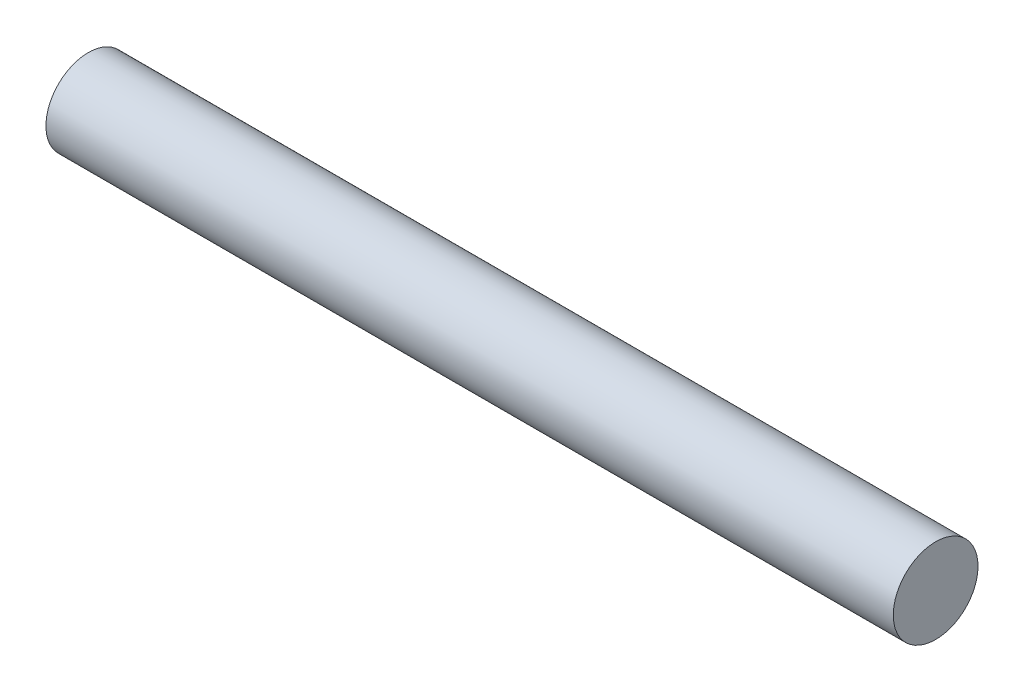
ISO-10303-21;
HEADER;
FILE_DESCRIPTION(('STEP AP214'),'2;1');
FILE_NAME('part.step','',(''),(''),'','','');
FILE_SCHEMA(('AUTOMOTIVE_DESIGN { 1 0 10303 214 1 1 1 1 }'));
ENDSEC;
DATA;
#1=APPLICATION_CONTEXT('core data for automotive mechanical design processes');
#2=APPLICATION_PROTOCOL_DEFINITION('international standard','automotive_design',2000,#1);
#3=PRODUCT_CONTEXT('',#1,'mechanical');
#4=PRODUCT('Part','Part','',(#3));
#5=PRODUCT_RELATED_PRODUCT_CATEGORY('part','',(#4));
#6=PRODUCT_DEFINITION_FORMATION('','',#4);
#7=PRODUCT_DEFINITION_CONTEXT('part definition',#1,'design');
#8=PRODUCT_DEFINITION('design','',#6,#7);
#9=PRODUCT_DEFINITION_SHAPE('','',#8);
#10=(LENGTH_UNIT() NAMED_UNIT(*) SI_UNIT(.MILLI.,.METRE.));
#11=(NAMED_UNIT(*) PLANE_ANGLE_UNIT() SI_UNIT($,.RADIAN.));
#12=(NAMED_UNIT(*) SI_UNIT($,.STERADIAN.) SOLID_ANGLE_UNIT());
#13=UNCERTAINTY_MEASURE_WITH_UNIT(LENGTH_MEASURE(1.E-05),#10,'distance_accuracy_value','');
#14=(GEOMETRIC_REPRESENTATION_CONTEXT(3) GLOBAL_UNCERTAINTY_ASSIGNED_CONTEXT((#13)) GLOBAL_UNIT_ASSIGNED_CONTEXT((#10,
#11,#12)) REPRESENTATION_CONTEXT('',''));
#15=CARTESIAN_POINT('',(0.,0.,0.));
#16=DIRECTION('',(0.,0.,1.));
#17=DIRECTION('',(1.,0.,0.));
#18=AXIS2_PLACEMENT_3D('',#15,#16,#17);
#19=CARTESIAN_POINT('',(30.,0.,0.));
#20=DIRECTION('',(-1.,0.,0.));
#21=DIRECTION('',(0.,0.,1.));
#22=AXIS2_PLACEMENT_3D('',#19,#20,#21);
#23=CYLINDRICAL_SURFACE('',#22,1.5);
#24=CARTESIAN_POINT('',(30.,0.,0.));
#25=DIRECTION('',(1.,0.,0.));
#26=DIRECTION('',(0.,0.,-1.));
#27=AXIS2_PLACEMENT_3D('',#24,#25,#26);
#28=CIRCLE('',#27,1.5);
#29=CARTESIAN_POINT('',(30.,0.,-1.5));
#30=VERTEX_POINT('',#29);
#31=EDGE_CURVE('E10',#30,#30,#28,.T.);
#32=ORIENTED_EDGE('',*,*,#31,.F.);
#33=EDGE_LOOP('',(#32));
#34=FACE_BOUND('',#33,.T.);
#35=CARTESIAN_POINT('',(0.,0.,0.));
#36=DIRECTION('',(1.,0.,0.));
#37=DIRECTION('',(0.,0.,-1.));
#38=AXIS2_PLACEMENT_3D('',#35,#36,#37);
#39=CIRCLE('',#38,1.5);
#40=CARTESIAN_POINT('',(0.,0.,-1.5));
#41=VERTEX_POINT('',#40);
#42=EDGE_CURVE('E40',#41,#41,#39,.T.);
#43=ORIENTED_EDGE('',*,*,#42,.T.);
#44=EDGE_LOOP('',(#43));
#45=FACE_BOUND('',#44,.T.);
#46=ADVANCED_FACE('F37',(#34,#45),#23,.T.);
#47=CARTESIAN_POINT('',(30.,0.,0.));
#48=DIRECTION('',(1.,0.,0.));
#49=DIRECTION('',(0.,0.,-1.));
#50=AXIS2_PLACEMENT_3D('',#47,#48,#49);
#51=PLANE('',#50);
#52=ORIENTED_EDGE('',*,*,#31,.T.);
#53=EDGE_LOOP('',(#52));
#54=FACE_BOUND('',#53,.T.);
#55=ADVANCED_FACE('F54',(#54),#51,.T.);
#56=CARTESIAN_POINT('',(0.,0.,0.));
#57=DIRECTION('',(1.,0.,0.));
#58=DIRECTION('',(0.,0.,-1.));
#59=AXIS2_PLACEMENT_3D('',#56,#57,#58);
#60=PLANE('',#59);
#61=ORIENTED_EDGE('',*,*,#42,.F.);
#62=EDGE_LOOP('',(#61));
#63=FACE_BOUND('',#62,.T.);
#64=ADVANCED_FACE('F52',(#63),#60,.F.);
#65=CLOSED_SHELL('',(#46,#55,#64));
#66=MANIFOLD_SOLID_BREP('B2',#65);
#67=ADVANCED_BREP_SHAPE_REPRESENTATION('',(#18,#66),#14);
#68=SHAPE_DEFINITION_REPRESENTATION(#9,#67);
ENDSEC;
END-ISO-10303-21;
